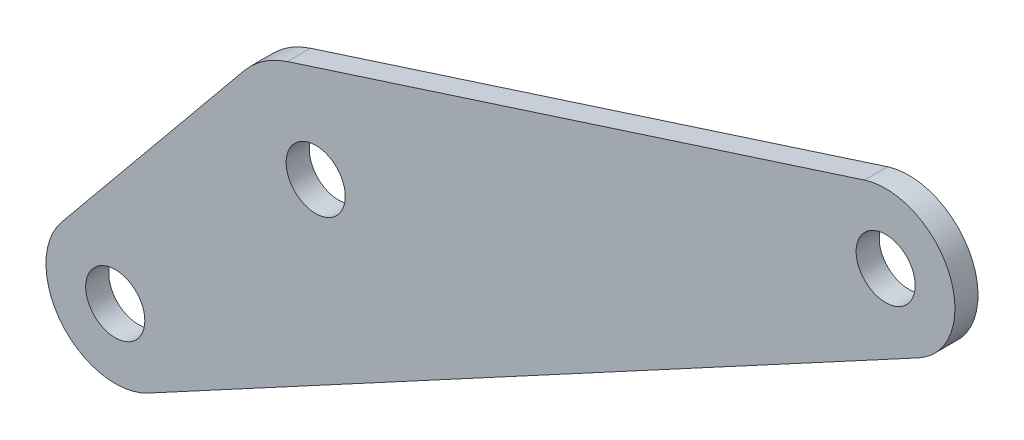
ISO-10303-21;
HEADER;
FILE_DESCRIPTION(('STEP AP214'),'2;1');
FILE_NAME('part.step','',(''),(''),'','','');
FILE_SCHEMA(('AUTOMOTIVE_DESIGN { 1 0 10303 214 1 1 1 1 }'));
ENDSEC;
DATA;
#1=APPLICATION_CONTEXT('core data for automotive mechanical design processes');
#2=APPLICATION_PROTOCOL_DEFINITION('international standard','automotive_design',2000,#1);
#3=PRODUCT_CONTEXT('',#1,'mechanical');
#4=PRODUCT('Part','Part','',(#3));
#5=PRODUCT_RELATED_PRODUCT_CATEGORY('part','',(#4));
#6=PRODUCT_DEFINITION_FORMATION('','',#4);
#7=PRODUCT_DEFINITION_CONTEXT('part definition',#1,'design');
#8=PRODUCT_DEFINITION('design','',#6,#7);
#9=PRODUCT_DEFINITION_SHAPE('','',#8);
#10=(LENGTH_UNIT() NAMED_UNIT(*) SI_UNIT(.MILLI.,.METRE.));
#11=(NAMED_UNIT(*) PLANE_ANGLE_UNIT() SI_UNIT($,.RADIAN.));
#12=(NAMED_UNIT(*) SI_UNIT($,.STERADIAN.) SOLID_ANGLE_UNIT());
#13=UNCERTAINTY_MEASURE_WITH_UNIT(LENGTH_MEASURE(1.E-05),#10,'distance_accuracy_value','');
#14=(GEOMETRIC_REPRESENTATION_CONTEXT(3) GLOBAL_UNCERTAINTY_ASSIGNED_CONTEXT((#13)) GLOBAL_UNIT_ASSIGNED_CONTEXT((#10,
#11,#12)) REPRESENTATION_CONTEXT('',''));
#15=CARTESIAN_POINT('',(0.,0.,0.));
#16=DIRECTION('',(0.,0.,1.));
#17=DIRECTION('',(1.,0.,0.));
#18=AXIS2_PLACEMENT_3D('',#15,#16,#17);
#19=CARTESIAN_POINT('',(0.,0.,1.5875));
#20=DIRECTION('',(0.,0.,1.));
#21=DIRECTION('',(1.,0.,0.));
#22=AXIS2_PLACEMENT_3D('',#19,#20,#21);
#23=PLANE('',#22);
#24=CARTESIAN_POINT('',(-13.7795000000004,-14.2875,1.5875));
#25=DIRECTION('',(0.,0.,1.));
#26=DIRECTION('',(1.,0.,0.));
#27=AXIS2_PLACEMENT_3D('',#24,#25,#26);
#28=CIRCLE('',#27,2.032);
#29=CARTESIAN_POINT('',(-11.7475000000004,-14.2875,1.5875));
#30=VERTEX_POINT('',#29);
#31=EDGE_CURVE('E190',#30,#30,#28,.T.);
#32=ORIENTED_EDGE('',*,*,#31,.F.);
#33=EDGE_LOOP('',(#32));
#34=FACE_BOUND('',#33,.T.);
#35=CARTESIAN_POINT('',(0.,0.,1.5875));
#36=DIRECTION('',(0.,0.,1.));
#37=DIRECTION('',(1.,0.,0.));
#38=AXIS2_PLACEMENT_3D('',#35,#36,#37);
#39=CIRCLE('',#38,6.35);
#40=CARTESIAN_POINT('',(-1.94683127224491,6.04419953322268,1.5875));
#41=VERTEX_POINT('',#40);
#42=CARTESIAN_POINT('',(-4.90855458733158,4.02847264644879,1.5875));
#43=VERTEX_POINT('',#42);
#44=EDGE_CURVE('E135',#41,#43,#39,.T.);
#45=ORIENTED_EDGE('',*,*,#44,.T.);
#46=DIRECTION('',(-0.634405141173038,-0.773000722414422,0.));
#47=VECTOR('',#46,1.);
#48=CARTESIAN_POINT('',(-17.460915940499,-11.2661455151634,1.5875));
#49=LINE('',#48,#47);
#50=CARTESIAN_POINT('',(-17.460915940499,-11.2661455151634,1.5875));
#51=VERTEX_POINT('',#50);
#52=EDGE_CURVE('E93',#43,#51,#49,.T.);
#53=ORIENTED_EDGE('',*,*,#52,.T.);
#54=CARTESIAN_POINT('',(-13.7795000000004,-14.2875,1.5875));
#55=DIRECTION('',(0.,0.,1.));
#56=DIRECTION('',(1.,0.,0.));
#57=AXIS2_PLACEMENT_3D('',#54,#55,#56);
#58=CIRCLE('',#57,4.7625);
#59=CARTESIAN_POINT('',(-11.5180041606804,-18.4788056222064,1.5875));
#60=VERTEX_POINT('',#59);
#61=EDGE_CURVE('E106',#51,#60,#58,.T.);
#62=ORIENTED_EDGE('',*,*,#61,.T.);
#63=DIRECTION('',(0.880064172641751,0.474854769411017,0.));
#64=VECTOR('',#63,1.);
#65=CARTESIAN_POINT('',(41.4409958393196,10.0961943777936,1.5875));
#66=LINE('',#65,#64);
#67=CARTESIAN_POINT('',(41.4409958393196,10.0961943777936,1.5875));
#68=VERTEX_POINT('',#67);
#69=EDGE_CURVE('E100',#60,#68,#66,.T.);
#70=ORIENTED_EDGE('',*,*,#69,.T.);
#71=CARTESIAN_POINT('',(39.1794999999996,14.2875,1.5875));
#72=DIRECTION('',(0.,0.,1.));
#73=DIRECTION('',(-1.,0.,0.));
#74=AXIS2_PLACEMENT_3D('',#71,#72,#73);
#75=CIRCLE('',#74,4.7625);
#76=CARTESIAN_POINT('',(37.719376545816,18.820649649917,1.5875));
#77=VERTEX_POINT('',#76);
#78=EDGE_CURVE('E104',#68,#77,#75,.T.);
#79=ORIENTED_EDGE('',*,*,#78,.T.);
#80=DIRECTION('',(-0.9518424461768,-0.306587601928333,0.));
#81=VECTOR('',#80,1.);
#82=CARTESIAN_POINT('',(37.719376545816,18.820649649917,1.5875));
#83=LINE('',#82,#81);
#84=EDGE_CURVE('E56',#77,#41,#83,.T.);
#85=ORIENTED_EDGE('',*,*,#84,.T.);
#86=EDGE_LOOP('',(#45,#53,#62,#70,#79,#85));
#87=FACE_BOUND('',#86,.T.);
#88=CARTESIAN_POINT('',(0.,0.,1.5875));
#89=DIRECTION('',(0.,0.,1.));
#90=DIRECTION('',(1.,0.,0.));
#91=AXIS2_PLACEMENT_3D('',#88,#89,#90);
#92=CIRCLE('',#91,2.032);
#93=CARTESIAN_POINT('',(2.032,0.,1.5875));
#94=VERTEX_POINT('',#93);
#95=EDGE_CURVE('E128',#94,#94,#92,.T.);
#96=ORIENTED_EDGE('',*,*,#95,.F.);
#97=EDGE_LOOP('',(#96));
#98=FACE_BOUND('',#97,.T.);
#99=CARTESIAN_POINT('',(39.1794999999996,14.2875,1.5875));
#100=DIRECTION('',(0.,0.,1.));
#101=DIRECTION('',(1.,0.,0.));
#102=AXIS2_PLACEMENT_3D('',#99,#100,#101);
#103=CIRCLE('',#102,2.032);
#104=CARTESIAN_POINT('',(41.2114999999996,14.2875,1.5875));
#105=VERTEX_POINT('',#104);
#106=EDGE_CURVE('E181',#105,#105,#103,.T.);
#107=ORIENTED_EDGE('',*,*,#106,.F.);
#108=EDGE_LOOP('',(#107));
#109=FACE_BOUND('',#108,.T.);
#110=ADVANCED_FACE('F39',(#34,#87,#98,#109),#23,.T.);
#111=CARTESIAN_POINT('',(0.,0.,0.));
#112=DIRECTION('',(0.,0.,1.));
#113=DIRECTION('',(1.,0.,0.));
#114=AXIS2_PLACEMENT_3D('',#111,#112,#113);
#115=PLANE('',#114);
#116=CARTESIAN_POINT('',(0.,0.,0.));
#117=DIRECTION('',(0.,0.,1.));
#118=DIRECTION('',(1.,0.,0.));
#119=AXIS2_PLACEMENT_3D('',#116,#117,#118);
#120=CIRCLE('',#119,6.35);
#121=CARTESIAN_POINT('',(-1.94683127224491,6.04419953322268,0.));
#122=VERTEX_POINT('',#121);
#123=CARTESIAN_POINT('',(-4.90855458733158,4.02847264644879,0.));
#124=VERTEX_POINT('',#123);
#125=EDGE_CURVE('E124',#122,#124,#120,.T.);
#126=ORIENTED_EDGE('',*,*,#125,.F.);
#127=DIRECTION('',(-0.9518424461768,-0.306587601928333,0.));
#128=VECTOR('',#127,1.);
#129=CARTESIAN_POINT('',(37.719376545816,18.820649649917,0.));
#130=LINE('',#129,#128);
#131=CARTESIAN_POINT('',(37.719376545816,18.820649649917,0.));
#132=VERTEX_POINT('',#131);
#133=EDGE_CURVE('E85',#132,#122,#130,.T.);
#134=ORIENTED_EDGE('',*,*,#133,.F.);
#135=CARTESIAN_POINT('',(39.1794999999996,14.2875,0.));
#136=DIRECTION('',(0.,0.,1.));
#137=DIRECTION('',(-1.,0.,0.));
#138=AXIS2_PLACEMENT_3D('',#135,#136,#137);
#139=CIRCLE('',#138,4.7625);
#140=CARTESIAN_POINT('',(41.4409958393196,10.0961943777936,0.));
#141=VERTEX_POINT('',#140);
#142=EDGE_CURVE('E79',#141,#132,#139,.T.);
#143=ORIENTED_EDGE('',*,*,#142,.F.);
#144=DIRECTION('',(0.880064172641751,0.474854769411017,0.));
#145=VECTOR('',#144,1.);
#146=CARTESIAN_POINT('',(41.4409958393196,10.0961943777936,0.));
#147=LINE('',#146,#145);
#148=CARTESIAN_POINT('',(-11.5180041606804,-18.4788056222064,0.));
#149=VERTEX_POINT('',#148);
#150=EDGE_CURVE('E114',#149,#141,#147,.T.);
#151=ORIENTED_EDGE('',*,*,#150,.F.);
#152=CARTESIAN_POINT('',(-13.7795000000004,-14.2875,0.));
#153=DIRECTION('',(0.,0.,1.));
#154=DIRECTION('',(1.,0.,0.));
#155=AXIS2_PLACEMENT_3D('',#152,#153,#154);
#156=CIRCLE('',#155,4.7625);
#157=CARTESIAN_POINT('',(-17.460915940499,-11.2661455151634,0.));
#158=VERTEX_POINT('',#157);
#159=EDGE_CURVE('E130',#158,#149,#156,.T.);
#160=ORIENTED_EDGE('',*,*,#159,.F.);
#161=DIRECTION('',(-0.634405141173038,-0.773000722414422,0.));
#162=VECTOR('',#161,1.);
#163=CARTESIAN_POINT('',(-17.460915940499,-11.2661455151634,0.));
#164=LINE('',#163,#162);
#165=EDGE_CURVE('E127',#124,#158,#164,.T.);
#166=ORIENTED_EDGE('',*,*,#165,.F.);
#167=EDGE_LOOP('',(#126,#134,#143,#151,#160,#166));
#168=FACE_BOUND('',#167,.T.);
#169=CARTESIAN_POINT('',(0.,0.,0.));
#170=DIRECTION('',(0.,0.,1.));
#171=DIRECTION('',(1.,0.,0.));
#172=AXIS2_PLACEMENT_3D('',#169,#170,#171);
#173=CIRCLE('',#172,2.032);
#174=CARTESIAN_POINT('',(2.032,0.,0.));
#175=VERTEX_POINT('',#174);
#176=EDGE_CURVE('E193',#175,#175,#173,.T.);
#177=ORIENTED_EDGE('',*,*,#176,.T.);
#178=EDGE_LOOP('',(#177));
#179=FACE_BOUND('',#178,.T.);
#180=CARTESIAN_POINT('',(-13.7795000000004,-14.2875,0.));
#181=DIRECTION('',(0.,0.,1.));
#182=DIRECTION('',(1.,0.,0.));
#183=AXIS2_PLACEMENT_3D('',#180,#181,#182);
#184=CIRCLE('',#183,2.032);
#185=CARTESIAN_POINT('',(-11.7475000000004,-14.2875,0.));
#186=VERTEX_POINT('',#185);
#187=EDGE_CURVE('E187',#186,#186,#184,.T.);
#188=ORIENTED_EDGE('',*,*,#187,.T.);
#189=EDGE_LOOP('',(#188));
#190=FACE_BOUND('',#189,.T.);
#191=CARTESIAN_POINT('',(39.1794999999996,14.2875,0.));
#192=DIRECTION('',(0.,0.,1.));
#193=DIRECTION('',(1.,0.,0.));
#194=AXIS2_PLACEMENT_3D('',#191,#192,#193);
#195=CIRCLE('',#194,2.032);
#196=CARTESIAN_POINT('',(41.2114999999996,14.2875,0.));
#197=VERTEX_POINT('',#196);
#198=EDGE_CURVE('E184',#197,#197,#195,.T.);
#199=ORIENTED_EDGE('',*,*,#198,.T.);
#200=EDGE_LOOP('',(#199));
#201=FACE_BOUND('',#200,.T.);
#202=ADVANCED_FACE('F144',(#168,#179,#190,#201),#115,.F.);
#203=CARTESIAN_POINT('',(0.,0.,1.5875));
#204=DIRECTION('',(0.,0.,-1.));
#205=DIRECTION('',(-1.,0.,0.));
#206=AXIS2_PLACEMENT_3D('',#203,#204,#205);
#207=CYLINDRICAL_SURFACE('',#206,6.35);
#208=ORIENTED_EDGE('',*,*,#125,.T.);
#209=DIRECTION('',(0.,0.,-1.));
#210=VECTOR('',#209,1.);
#211=CARTESIAN_POINT('',(-4.90855458733158,4.02847264644879,1.5875));
#212=LINE('',#211,#210);
#213=EDGE_CURVE('E11',#43,#124,#212,.T.);
#214=ORIENTED_EDGE('',*,*,#213,.F.);
#215=ORIENTED_EDGE('',*,*,#44,.F.);
#216=DIRECTION('',(0.,0.,-1.));
#217=VECTOR('',#216,1.);
#218=CARTESIAN_POINT('',(-1.94683127224491,6.04419953322268,1.5875));
#219=LINE('',#218,#217);
#220=EDGE_CURVE('E120',#41,#122,#219,.T.);
#221=ORIENTED_EDGE('',*,*,#220,.T.);
#222=EDGE_LOOP('',(#208,#214,#215,#221));
#223=FACE_BOUND('',#222,.T.);
#224=ADVANCED_FACE('F41',(#223),#207,.T.);
#225=CARTESIAN_POINT('',(-17.460915940499,-11.2661455151634,1.5875));
#226=DIRECTION('',(0.773000722414422,-0.634405141173038,0.));
#227=DIRECTION('',(0.634405141173038,0.773000722414422,0.));
#228=AXIS2_PLACEMENT_3D('',#225,#226,#227);
#229=PLANE('',#228);
#230=ORIENTED_EDGE('',*,*,#165,.T.);
#231=DIRECTION('',(0.,0.,-1.));
#232=VECTOR('',#231,1.);
#233=CARTESIAN_POINT('',(-17.460915940499,-11.2661455151634,1.5875));
#234=LINE('',#233,#232);
#235=EDGE_CURVE('E48',#51,#158,#234,.T.);
#236=ORIENTED_EDGE('',*,*,#235,.F.);
#237=ORIENTED_EDGE('',*,*,#52,.F.);
#238=ORIENTED_EDGE('',*,*,#213,.T.);
#239=EDGE_LOOP('',(#230,#236,#237,#238));
#240=FACE_BOUND('',#239,.T.);
#241=ADVANCED_FACE('F246',(#240),#229,.F.);
#242=CARTESIAN_POINT('',(-13.7795000000004,-14.2875,1.5875));
#243=DIRECTION('',(0.,0.,-1.));
#244=DIRECTION('',(-1.,0.,0.));
#245=AXIS2_PLACEMENT_3D('',#242,#243,#244);
#246=CYLINDRICAL_SURFACE('',#245,4.7625);
#247=ORIENTED_EDGE('',*,*,#159,.T.);
#248=DIRECTION('',(0.,0.,-1.));
#249=VECTOR('',#248,1.);
#250=CARTESIAN_POINT('',(-11.5180041606804,-18.4788056222064,1.5875));
#251=LINE('',#250,#249);
#252=EDGE_CURVE('E115',#60,#149,#251,.T.);
#253=ORIENTED_EDGE('',*,*,#252,.F.);
#254=ORIENTED_EDGE('',*,*,#61,.F.);
#255=ORIENTED_EDGE('',*,*,#235,.T.);
#256=EDGE_LOOP('',(#247,#253,#254,#255));
#257=FACE_BOUND('',#256,.T.);
#258=ADVANCED_FACE('F141',(#257),#246,.T.);
#259=CARTESIAN_POINT('',(41.4409958393196,10.0961943777936,1.5875));
#260=DIRECTION('',(-0.474854769411017,0.880064172641751,0.));
#261=DIRECTION('',(-0.880064172641751,-0.474854769411017,0.));
#262=AXIS2_PLACEMENT_3D('',#259,#260,#261);
#263=PLANE('',#262);
#264=ORIENTED_EDGE('',*,*,#150,.T.);
#265=DIRECTION('',(0.,0.,-1.));
#266=VECTOR('',#265,1.);
#267=CARTESIAN_POINT('',(41.4409958393196,10.0961943777936,1.5875));
#268=LINE('',#267,#266);
#269=EDGE_CURVE('E111',#68,#141,#268,.T.);
#270=ORIENTED_EDGE('',*,*,#269,.F.);
#271=ORIENTED_EDGE('',*,*,#69,.F.);
#272=ORIENTED_EDGE('',*,*,#252,.T.);
#273=EDGE_LOOP('',(#264,#270,#271,#272));
#274=FACE_BOUND('',#273,.T.);
#275=ADVANCED_FACE('F112',(#274),#263,.F.);
#276=CARTESIAN_POINT('',(39.1794999999996,14.2875,1.5875));
#277=DIRECTION('',(0.,0.,-1.));
#278=DIRECTION('',(-1.,0.,0.));
#279=AXIS2_PLACEMENT_3D('',#276,#277,#278);
#280=CYLINDRICAL_SURFACE('',#279,4.7625);
#281=ORIENTED_EDGE('',*,*,#142,.T.);
#282=DIRECTION('',(0.,0.,-1.));
#283=VECTOR('',#282,1.);
#284=CARTESIAN_POINT('',(37.719376545816,18.820649649917,1.5875));
#285=LINE('',#284,#283);
#286=EDGE_CURVE('E116',#77,#132,#285,.T.);
#287=ORIENTED_EDGE('',*,*,#286,.F.);
#288=ORIENTED_EDGE('',*,*,#78,.F.);
#289=ORIENTED_EDGE('',*,*,#269,.T.);
#290=EDGE_LOOP('',(#281,#287,#288,#289));
#291=FACE_BOUND('',#290,.T.);
#292=ADVANCED_FACE('F118',(#291),#280,.T.);
#293=CARTESIAN_POINT('',(37.719376545816,18.820649649917,1.5875));
#294=DIRECTION('',(0.306587601928333,-0.9518424461768,0.));
#295=DIRECTION('',(0.9518424461768,0.306587601928333,0.));
#296=AXIS2_PLACEMENT_3D('',#293,#294,#295);
#297=PLANE('',#296);
#298=ORIENTED_EDGE('',*,*,#133,.T.);
#299=ORIENTED_EDGE('',*,*,#220,.F.);
#300=ORIENTED_EDGE('',*,*,#84,.F.);
#301=ORIENTED_EDGE('',*,*,#286,.T.);
#302=EDGE_LOOP('',(#298,#299,#300,#301));
#303=FACE_BOUND('',#302,.T.);
#304=ADVANCED_FACE('F149',(#303),#297,.F.);
#305=CARTESIAN_POINT('',(0.,0.,1.5875));
#306=DIRECTION('',(0.,0.,-1.));
#307=DIRECTION('',(-1.,0.,0.));
#308=AXIS2_PLACEMENT_3D('',#305,#306,#307);
#309=CYLINDRICAL_SURFACE('',#308,2.032);
#310=ORIENTED_EDGE('',*,*,#95,.T.);
#311=EDGE_LOOP('',(#310));
#312=FACE_BOUND('',#311,.T.);
#313=ORIENTED_EDGE('',*,*,#176,.F.);
#314=EDGE_LOOP('',(#313));
#315=FACE_BOUND('',#314,.T.);
#316=ADVANCED_FACE('F151',(#312,#315),#309,.F.);
#317=CARTESIAN_POINT('',(-13.7795000000004,-14.2875,1.5875));
#318=DIRECTION('',(0.,0.,-1.));
#319=DIRECTION('',(-1.,0.,0.));
#320=AXIS2_PLACEMENT_3D('',#317,#318,#319);
#321=CYLINDRICAL_SURFACE('',#320,2.032);
#322=ORIENTED_EDGE('',*,*,#31,.T.);
#323=EDGE_LOOP('',(#322));
#324=FACE_BOUND('',#323,.T.);
#325=ORIENTED_EDGE('',*,*,#187,.F.);
#326=EDGE_LOOP('',(#325));
#327=FACE_BOUND('',#326,.T.);
#328=ADVANCED_FACE('F157',(#324,#327),#321,.F.);
#329=CARTESIAN_POINT('',(39.1794999999996,14.2875,1.5875));
#330=DIRECTION('',(0.,0.,-1.));
#331=DIRECTION('',(-1.,0.,0.));
#332=AXIS2_PLACEMENT_3D('',#329,#330,#331);
#333=CYLINDRICAL_SURFACE('',#332,2.032);
#334=ORIENTED_EDGE('',*,*,#106,.T.);
#335=EDGE_LOOP('',(#334));
#336=FACE_BOUND('',#335,.T.);
#337=ORIENTED_EDGE('',*,*,#198,.F.);
#338=EDGE_LOOP('',(#337));
#339=FACE_BOUND('',#338,.T.);
#340=ADVANCED_FACE('F172',(#336,#339),#333,.F.);
#341=CLOSED_SHELL('',(#110,#202,#224,#241,#258,#275,#292,#304,#316,#328,#340));
#342=MANIFOLD_SOLID_BREP('B2',#341);
#343=ADVANCED_BREP_SHAPE_REPRESENTATION('',(#18,#342),#14);
#344=SHAPE_DEFINITION_REPRESENTATION(#9,#343);
ENDSEC;
END-ISO-10303-21;
